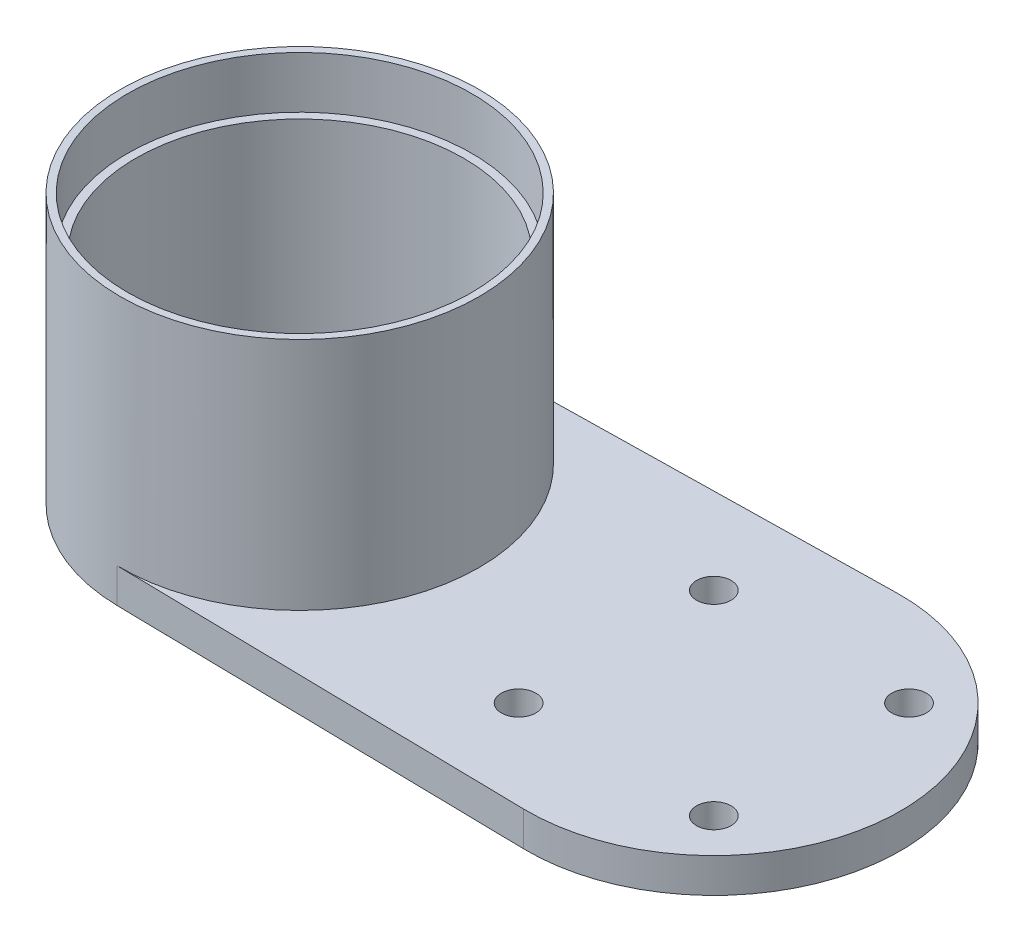
ISO-10303-21;
HEADER;
FILE_DESCRIPTION(('STEP AP214'),'2;1');
FILE_NAME('part.step','',(''),(''),'','','');
FILE_SCHEMA(('AUTOMOTIVE_DESIGN { 1 0 10303 214 1 1 1 1 }'));
ENDSEC;
DATA;
#1=APPLICATION_CONTEXT('core data for automotive mechanical design processes');
#2=APPLICATION_PROTOCOL_DEFINITION('international standard','automotive_design',2000,#1);
#3=PRODUCT_CONTEXT('',#1,'mechanical');
#4=PRODUCT('Part','Part','',(#3));
#5=PRODUCT_RELATED_PRODUCT_CATEGORY('part','',(#4));
#6=PRODUCT_DEFINITION_FORMATION('','',#4);
#7=PRODUCT_DEFINITION_CONTEXT('part definition',#1,'design');
#8=PRODUCT_DEFINITION('design','',#6,#7);
#9=PRODUCT_DEFINITION_SHAPE('','',#8);
#10=(LENGTH_UNIT() NAMED_UNIT(*) SI_UNIT(.MILLI.,.METRE.));
#11=(NAMED_UNIT(*) PLANE_ANGLE_UNIT() SI_UNIT($,.RADIAN.));
#12=(NAMED_UNIT(*) SI_UNIT($,.STERADIAN.) SOLID_ANGLE_UNIT());
#13=UNCERTAINTY_MEASURE_WITH_UNIT(LENGTH_MEASURE(1.E-05),#10,'distance_accuracy_value','');
#14=(GEOMETRIC_REPRESENTATION_CONTEXT(3) GLOBAL_UNCERTAINTY_ASSIGNED_CONTEXT((#13)) GLOBAL_UNIT_ASSIGNED_CONTEXT((#10,
#11,#12)) REPRESENTATION_CONTEXT('',''));
#15=CARTESIAN_POINT('',(0.,0.,0.));
#16=DIRECTION('',(0.,0.,1.));
#17=DIRECTION('',(1.,0.,0.));
#18=AXIS2_PLACEMENT_3D('',#15,#16,#17);
#19=CARTESIAN_POINT('',(0.,7.5,0.));
#20=DIRECTION('',(0.,-1.,0.));
#21=DIRECTION('',(0.,0.,-1.));
#22=AXIS2_PLACEMENT_3D('',#19,#20,#21);
#23=CYLINDRICAL_SURFACE('',#22,26.);
#24=CARTESIAN_POINT('',(0.,7.5,0.));
#25=DIRECTION('',(0.,1.,0.));
#26=DIRECTION('',(0.,0.,1.));
#27=AXIS2_PLACEMENT_3D('',#24,#25,#26);
#28=CIRCLE('',#27,26.);
#29=CARTESIAN_POINT('',(0.,7.5,26.));
#30=VERTEX_POINT('',#29);
#31=EDGE_CURVE('E11',#30,#30,#28,.T.);
#32=ORIENTED_EDGE('',*,*,#31,.F.);
#33=EDGE_LOOP('',(#32));
#34=FACE_BOUND('',#33,.T.);
#35=DIRECTION('',(0.,-1.,0.));
#36=VECTOR('',#35,1.);
#37=CARTESIAN_POINT('',(-0.467999999999999,-26.5,25.9957876587727));
#38=LINE('',#37,#36);
#39=CARTESIAN_POINT('',(-0.467999999999999,-26.5,25.9957876587727));
#40=VERTEX_POINT('',#39);
#41=CARTESIAN_POINT('',(-0.467999999999999,-31.5,25.9957876587727));
#42=VERTEX_POINT('',#41);
#43=EDGE_CURVE('E125',#40,#42,#38,.T.);
#44=ORIENTED_EDGE('',*,*,#43,.F.);
#45=CARTESIAN_POINT('',(0.,-26.5,0.));
#46=DIRECTION('',(0.,1.,0.));
#47=DIRECTION('',(0.,0.,1.));
#48=AXIS2_PLACEMENT_3D('',#45,#46,#47);
#49=CIRCLE('',#48,26.);
#50=CARTESIAN_POINT('',(-0.467999999999999,-26.5,-25.9957876587727));
#51=VERTEX_POINT('',#50);
#52=EDGE_CURVE('E69',#40,#51,#49,.T.);
#53=ORIENTED_EDGE('',*,*,#52,.T.);
#54=DIRECTION('',(0.,-1.,0.));
#55=VECTOR('',#54,1.);
#56=CARTESIAN_POINT('',(-0.467999999999999,-26.5,-25.9957876587727));
#57=LINE('',#56,#55);
#58=CARTESIAN_POINT('',(-0.467999999999999,-31.5,-25.9957876587727));
#59=VERTEX_POINT('',#58);
#60=EDGE_CURVE('E93',#51,#59,#57,.T.);
#61=ORIENTED_EDGE('',*,*,#60,.T.);
#62=CARTESIAN_POINT('',(0.,-31.5,0.));
#63=DIRECTION('',(0.,-1.,0.));
#64=DIRECTION('',(0.,0.,-1.));
#65=AXIS2_PLACEMENT_3D('',#62,#63,#64);
#66=CIRCLE('',#65,26.);
#67=EDGE_CURVE('E148',#42,#59,#66,.T.);
#68=ORIENTED_EDGE('',*,*,#67,.F.);
#69=EDGE_LOOP('',(#44,#53,#61,#68));
#70=FACE_BOUND('',#69,.T.);
#71=ADVANCED_FACE('F45',(#34,#70),#23,.T.);
#72=CARTESIAN_POINT('',(0.,-31.5,0.));
#73=DIRECTION('',(0.,1.,0.));
#74=DIRECTION('',(0.,0.,1.));
#75=AXIS2_PLACEMENT_3D('',#72,#73,#74);
#76=CYLINDRICAL_SURFACE('',#75,23.75);
#77=CARTESIAN_POINT('',(0.,0.,0.));
#78=DIRECTION('',(0.,-1.,0.));
#79=DIRECTION('',(0.,0.,-1.));
#80=AXIS2_PLACEMENT_3D('',#77,#78,#79);
#81=CIRCLE('',#80,23.75);
#82=CARTESIAN_POINT('',(0.,0.,-23.75));
#83=VERTEX_POINT('',#82);
#84=EDGE_CURVE('E144',#83,#83,#81,.T.);
#85=ORIENTED_EDGE('',*,*,#84,.F.);
#86=EDGE_LOOP('',(#85));
#87=FACE_BOUND('',#86,.T.);
#88=CARTESIAN_POINT('',(0.,-30.5,0.));
#89=DIRECTION('',(0.,-1.,0.));
#90=DIRECTION('',(0.,0.,-1.));
#91=AXIS2_PLACEMENT_3D('',#88,#89,#90);
#92=CIRCLE('',#91,23.75);
#93=CARTESIAN_POINT('',(0.,-30.5,-23.75));
#94=VERTEX_POINT('',#93);
#95=EDGE_CURVE('E137',#94,#94,#92,.T.);
#96=ORIENTED_EDGE('',*,*,#95,.T.);
#97=EDGE_LOOP('',(#96));
#98=FACE_BOUND('',#97,.T.);
#99=ADVANCED_FACE('F172',(#87,#98),#76,.F.);
#100=CARTESIAN_POINT('',(0.,7.5,0.));
#101=DIRECTION('',(0.,1.,0.));
#102=DIRECTION('',(0.,0.,1.));
#103=AXIS2_PLACEMENT_3D('',#100,#101,#102);
#104=PLANE('',#103);
#105=ORIENTED_EDGE('',*,*,#31,.T.);
#106=EDGE_LOOP('',(#105));
#107=FACE_BOUND('',#106,.T.);
#108=CARTESIAN_POINT('',(0.,7.5,0.));
#109=DIRECTION('',(0.,1.,0.));
#110=DIRECTION('',(0.,0.,1.));
#111=AXIS2_PLACEMENT_3D('',#108,#109,#110);
#112=CIRCLE('',#111,24.95);
#113=CARTESIAN_POINT('',(0.,7.5,24.95));
#114=VERTEX_POINT('',#113);
#115=EDGE_CURVE('E53',#114,#114,#112,.T.);
#116=ORIENTED_EDGE('',*,*,#115,.F.);
#117=EDGE_LOOP('',(#116));
#118=FACE_BOUND('',#117,.T.);
#119=ADVANCED_FACE('F162',(#107,#118),#104,.T.);
#120=CARTESIAN_POINT('',(0.,7.5,0.));
#121=DIRECTION('',(0.,-1.,0.));
#122=DIRECTION('',(0.,0.,-1.));
#123=AXIS2_PLACEMENT_3D('',#120,#121,#122);
#124=CYLINDRICAL_SURFACE('',#123,24.95);
#125=ORIENTED_EDGE('',*,*,#115,.T.);
#126=EDGE_LOOP('',(#125));
#127=FACE_BOUND('',#126,.T.);
#128=CARTESIAN_POINT('',(0.,0.,0.));
#129=DIRECTION('',(0.,1.,0.));
#130=DIRECTION('',(0.,0.,1.));
#131=AXIS2_PLACEMENT_3D('',#128,#129,#130);
#132=CIRCLE('',#131,24.95);
#133=CARTESIAN_POINT('',(0.,0.,24.95));
#134=VERTEX_POINT('',#133);
#135=EDGE_CURVE('E151',#134,#134,#132,.T.);
#136=ORIENTED_EDGE('',*,*,#135,.F.);
#137=EDGE_LOOP('',(#136));
#138=FACE_BOUND('',#137,.T.);
#139=ADVANCED_FACE('F160',(#127,#138),#124,.F.);
#140=CARTESIAN_POINT('',(0.,0.,0.));
#141=DIRECTION('',(0.,-1.,0.));
#142=DIRECTION('',(0.,0.,-1.));
#143=AXIS2_PLACEMENT_3D('',#140,#141,#142);
#144=PLANE('',#143);
#145=ORIENTED_EDGE('',*,*,#84,.T.);
#146=EDGE_LOOP('',(#145));
#147=FACE_BOUND('',#146,.T.);
#148=ORIENTED_EDGE('',*,*,#135,.T.);
#149=EDGE_LOOP('',(#148));
#150=FACE_BOUND('',#149,.T.);
#151=ADVANCED_FACE('F158',(#147,#150),#144,.F.);
#152=CARTESIAN_POINT('',(0.,-31.5,0.));
#153=DIRECTION('',(0.,-1.,0.));
#154=DIRECTION('',(0.,0.,-1.));
#155=AXIS2_PLACEMENT_3D('',#152,#153,#154);
#156=PLANE('',#155);
#157=CARTESIAN_POINT('',(45.8578643762691,-31.5,14.1421356237302));
#158=DIRECTION('',(0.,-1.,0.));
#159=DIRECTION('',(0.,0.,-1.));
#160=AXIS2_PLACEMENT_3D('',#157,#158,#159);
#161=CIRCLE('',#160,2.5);
#162=CARTESIAN_POINT('',(45.8578643762691,-31.5,11.6421356237302));
#163=VERTEX_POINT('',#162);
#164=EDGE_CURVE('E213',#163,#163,#161,.T.);
#165=ORIENTED_EDGE('',*,*,#164,.F.);
#166=EDGE_LOOP('',(#165));
#167=FACE_BOUND('',#166,.T.);
#168=CARTESIAN_POINT('',(45.8578643762699,-31.5,-14.1421356237318));
#169=DIRECTION('',(0.,-1.,0.));
#170=DIRECTION('',(0.,0.,-1.));
#171=AXIS2_PLACEMENT_3D('',#168,#169,#170);
#172=CIRCLE('',#171,2.5);
#173=CARTESIAN_POINT('',(45.8578643762699,-31.5,-16.6421356237318));
#174=VERTEX_POINT('',#173);
#175=EDGE_CURVE('E217',#174,#174,#172,.T.);
#176=ORIENTED_EDGE('',*,*,#175,.F.);
#177=EDGE_LOOP('',(#176));
#178=FACE_BOUND('',#177,.T.);
#179=CARTESIAN_POINT('',(74.1421356237318,-31.5,-14.1421356237309));
#180=DIRECTION('',(0.,-1.,0.));
#181=DIRECTION('',(0.,0.,-1.));
#182=AXIS2_PLACEMENT_3D('',#179,#180,#181);
#183=CIRCLE('',#182,2.5);
#184=CARTESIAN_POINT('',(74.1421356237318,-31.5,-16.6421356237309));
#185=VERTEX_POINT('',#184);
#186=EDGE_CURVE('E221',#185,#185,#183,.T.);
#187=ORIENTED_EDGE('',*,*,#186,.F.);
#188=EDGE_LOOP('',(#187));
#189=FACE_BOUND('',#188,.T.);
#190=CARTESIAN_POINT('',(74.1421356237308,-31.5,14.1421356237311));
#191=DIRECTION('',(0.,-1.,0.));
#192=DIRECTION('',(0.,0.,-1.));
#193=AXIS2_PLACEMENT_3D('',#190,#191,#192);
#194=CIRCLE('',#193,2.49999999999999);
#195=CARTESIAN_POINT('',(74.1421356237308,-31.5,11.6421356237311));
#196=VERTEX_POINT('',#195);
#197=EDGE_CURVE('E225',#196,#196,#194,.T.);
#198=ORIENTED_EDGE('',*,*,#197,.F.);
#199=EDGE_LOOP('',(#198));
#200=FACE_BOUND('',#199,.T.);
#201=CARTESIAN_POINT('',(0.,-31.5,0.));
#202=DIRECTION('',(0.,-1.,0.));
#203=DIRECTION('',(0.,0.,-1.));
#204=AXIS2_PLACEMENT_3D('',#201,#202,#203);
#205=CIRCLE('',#204,3.);
#206=CARTESIAN_POINT('',(0.,-31.5,-3.));
#207=VERTEX_POINT('',#206);
#208=EDGE_CURVE('E128',#207,#207,#205,.T.);
#209=ORIENTED_EDGE('',*,*,#208,.F.);
#210=EDGE_LOOP('',(#209));
#211=FACE_BOUND('',#210,.T.);
#212=ORIENTED_EDGE('',*,*,#67,.T.);
#213=DIRECTION('',(0.999837986875874,0.,-0.018));
#214=VECTOR('',#213,1.);
#215=CARTESIAN_POINT('',(59.51256,-31.5,-27.0756126845987));
#216=LINE('',#215,#214);
#217=CARTESIAN_POINT('',(59.51256,-31.5,-27.0756126845987));
#218=VERTEX_POINT('',#217);
#219=EDGE_CURVE('E117',#59,#218,#216,.T.);
#220=ORIENTED_EDGE('',*,*,#219,.T.);
#221=CARTESIAN_POINT('',(60.,-31.5,0.));
#222=DIRECTION('',(0.,-1.,0.));
#223=DIRECTION('',(0.,0.,-1.));
#224=AXIS2_PLACEMENT_3D('',#221,#222,#223);
#225=CIRCLE('',#224,27.08);
#226=CARTESIAN_POINT('',(59.51256,-31.5,27.0756126845987));
#227=VERTEX_POINT('',#226);
#228=EDGE_CURVE('E99',#218,#227,#225,.T.);
#229=ORIENTED_EDGE('',*,*,#228,.T.);
#230=DIRECTION('',(-0.999837986875874,0.,-0.018));
#231=VECTOR('',#230,1.);
#232=CARTESIAN_POINT('',(-0.467999999999999,-31.5,25.9957876587727));
#233=LINE('',#232,#231);
#234=EDGE_CURVE('E60',#227,#42,#233,.T.);
#235=ORIENTED_EDGE('',*,*,#234,.T.);
#236=EDGE_LOOP('',(#212,#220,#229,#235));
#237=FACE_BOUND('',#236,.T.);
#238=ADVANCED_FACE('F169',(#167,#178,#189,#200,#211,#237),#156,.T.);
#239=CARTESIAN_POINT('',(0.,-30.5,0.));
#240=DIRECTION('',(0.,-1.,0.));
#241=DIRECTION('',(0.,0.,-1.));
#242=AXIS2_PLACEMENT_3D('',#239,#240,#241);
#243=PLANE('',#242);
#244=CARTESIAN_POINT('',(0.,-30.5,0.));
#245=DIRECTION('',(0.,-1.,0.));
#246=DIRECTION('',(0.,0.,-1.));
#247=AXIS2_PLACEMENT_3D('',#244,#245,#246);
#248=CIRCLE('',#247,3.);
#249=CARTESIAN_POINT('',(0.,-30.5,-3.));
#250=VERTEX_POINT('',#249);
#251=EDGE_CURVE('E133',#250,#250,#248,.T.);
#252=ORIENTED_EDGE('',*,*,#251,.T.);
#253=EDGE_LOOP('',(#252));
#254=FACE_BOUND('',#253,.T.);
#255=ORIENTED_EDGE('',*,*,#95,.F.);
#256=EDGE_LOOP('',(#255));
#257=FACE_BOUND('',#256,.T.);
#258=ADVANCED_FACE('F195',(#254,#257),#243,.F.);
#259=CARTESIAN_POINT('',(0.,-30.5,0.));
#260=DIRECTION('',(0.,-1.,0.));
#261=DIRECTION('',(0.,0.,-1.));
#262=AXIS2_PLACEMENT_3D('',#259,#260,#261);
#263=CYLINDRICAL_SURFACE('',#262,3.);
#264=ORIENTED_EDGE('',*,*,#251,.F.);
#265=EDGE_LOOP('',(#264));
#266=FACE_BOUND('',#265,.T.);
#267=ORIENTED_EDGE('',*,*,#208,.T.);
#268=EDGE_LOOP('',(#267));
#269=FACE_BOUND('',#268,.T.);
#270=ADVANCED_FACE('F188',(#266,#269),#263,.F.);
#271=CARTESIAN_POINT('',(-0.467999999999999,-26.5,25.9957876587727));
#272=DIRECTION('',(-0.018,0.,0.999837986875874));
#273=DIRECTION('',(0.999837986875874,0.,0.018));
#274=AXIS2_PLACEMENT_3D('',#271,#272,#273);
#275=PLANE('',#274);
#276=ORIENTED_EDGE('',*,*,#234,.F.);
#277=DIRECTION('',(0.,-1.,0.));
#278=VECTOR('',#277,1.);
#279=CARTESIAN_POINT('',(59.51256,-26.5,27.0756126845987));
#280=LINE('',#279,#278);
#281=CARTESIAN_POINT('',(59.51256,-26.5,27.0756126845987));
#282=VERTEX_POINT('',#281);
#283=EDGE_CURVE('E87',#282,#227,#280,.T.);
#284=ORIENTED_EDGE('',*,*,#283,.F.);
#285=DIRECTION('',(-0.999837986875874,0.,-0.018));
#286=VECTOR('',#285,1.);
#287=CARTESIAN_POINT('',(-0.467999999999999,-26.5,25.9957876587727));
#288=LINE('',#287,#286);
#289=EDGE_CURVE('E105',#282,#40,#288,.T.);
#290=ORIENTED_EDGE('',*,*,#289,.T.);
#291=ORIENTED_EDGE('',*,*,#43,.T.);
#292=EDGE_LOOP('',(#276,#284,#290,#291));
#293=FACE_BOUND('',#292,.T.);
#294=ADVANCED_FACE('F186',(#293),#275,.T.);
#295=CARTESIAN_POINT('',(60.,-26.5,0.));
#296=DIRECTION('',(0.,-1.,0.));
#297=DIRECTION('',(0.,0.,-1.));
#298=AXIS2_PLACEMENT_3D('',#295,#296,#297);
#299=CYLINDRICAL_SURFACE('',#298,27.08);
#300=ORIENTED_EDGE('',*,*,#228,.F.);
#301=DIRECTION('',(0.,-1.,0.));
#302=VECTOR('',#301,1.);
#303=CARTESIAN_POINT('',(59.51256,-26.5,-27.0756126845987));
#304=LINE('',#303,#302);
#305=CARTESIAN_POINT('',(59.51256,-26.5,-27.0756126845987));
#306=VERTEX_POINT('',#305);
#307=EDGE_CURVE('E95',#306,#218,#304,.T.);
#308=ORIENTED_EDGE('',*,*,#307,.F.);
#309=CARTESIAN_POINT('',(60.,-26.5,0.));
#310=DIRECTION('',(0.,-1.,0.));
#311=DIRECTION('',(0.,0.,-1.));
#312=AXIS2_PLACEMENT_3D('',#309,#310,#311);
#313=CIRCLE('',#312,27.08);
#314=EDGE_CURVE('E98',#306,#282,#313,.T.);
#315=ORIENTED_EDGE('',*,*,#314,.T.);
#316=ORIENTED_EDGE('',*,*,#283,.T.);
#317=EDGE_LOOP('',(#300,#308,#315,#316));
#318=FACE_BOUND('',#317,.T.);
#319=ADVANCED_FACE('F97',(#318),#299,.T.);
#320=CARTESIAN_POINT('',(59.51256,-26.5,-27.0756126845987));
#321=DIRECTION('',(-0.018,0.,-0.999837986875874));
#322=DIRECTION('',(-0.999837986875874,0.,0.018));
#323=AXIS2_PLACEMENT_3D('',#320,#321,#322);
#324=PLANE('',#323);
#325=ORIENTED_EDGE('',*,*,#219,.F.);
#326=ORIENTED_EDGE('',*,*,#60,.F.);
#327=DIRECTION('',(0.999837986875874,0.,-0.018));
#328=VECTOR('',#327,1.);
#329=CARTESIAN_POINT('',(59.51256,-26.5,-27.0756126845987));
#330=LINE('',#329,#328);
#331=EDGE_CURVE('E104',#51,#306,#330,.T.);
#332=ORIENTED_EDGE('',*,*,#331,.T.);
#333=ORIENTED_EDGE('',*,*,#307,.T.);
#334=EDGE_LOOP('',(#325,#326,#332,#333));
#335=FACE_BOUND('',#334,.T.);
#336=ADVANCED_FACE('F108',(#335),#324,.T.);
#337=CARTESIAN_POINT('',(0.,-26.5,0.));
#338=DIRECTION('',(0.,1.,0.));
#339=DIRECTION('',(0.,0.,1.));
#340=AXIS2_PLACEMENT_3D('',#337,#338,#339);
#341=PLANE('',#340);
#342=CARTESIAN_POINT('',(45.8578643762691,-26.5,14.1421356237302));
#343=DIRECTION('',(0.,-1.,0.));
#344=DIRECTION('',(0.,0.,-1.));
#345=AXIS2_PLACEMENT_3D('',#342,#343,#344);
#346=CIRCLE('',#345,2.5);
#347=CARTESIAN_POINT('',(45.8578643762691,-26.5,11.6421356237302));
#348=VERTEX_POINT('',#347);
#349=EDGE_CURVE('E237',#348,#348,#346,.T.);
#350=ORIENTED_EDGE('',*,*,#349,.T.);
#351=EDGE_LOOP('',(#350));
#352=FACE_BOUND('',#351,.T.);
#353=CARTESIAN_POINT('',(45.8578643762699,-26.5,-14.1421356237318));
#354=DIRECTION('',(0.,-1.,0.));
#355=DIRECTION('',(0.,0.,-1.));
#356=AXIS2_PLACEMENT_3D('',#353,#354,#355);
#357=CIRCLE('',#356,2.5);
#358=CARTESIAN_POINT('',(45.8578643762699,-26.5,-16.6421356237318));
#359=VERTEX_POINT('',#358);
#360=EDGE_CURVE('E243',#359,#359,#357,.T.);
#361=ORIENTED_EDGE('',*,*,#360,.T.);
#362=EDGE_LOOP('',(#361));
#363=FACE_BOUND('',#362,.T.);
#364=CARTESIAN_POINT('',(74.1421356237318,-26.5,-14.1421356237309));
#365=DIRECTION('',(0.,-1.,0.));
#366=DIRECTION('',(0.,0.,-1.));
#367=AXIS2_PLACEMENT_3D('',#364,#365,#366);
#368=CIRCLE('',#367,2.5);
#369=CARTESIAN_POINT('',(74.1421356237318,-26.5,-16.6421356237309));
#370=VERTEX_POINT('',#369);
#371=EDGE_CURVE('E234',#370,#370,#368,.T.);
#372=ORIENTED_EDGE('',*,*,#371,.T.);
#373=EDGE_LOOP('',(#372));
#374=FACE_BOUND('',#373,.T.);
#375=CARTESIAN_POINT('',(74.1421356237308,-26.5,14.1421356237311));
#376=DIRECTION('',(0.,-1.,0.));
#377=DIRECTION('',(0.,0.,-1.));
#378=AXIS2_PLACEMENT_3D('',#375,#376,#377);
#379=CIRCLE('',#378,2.49999999999999);
#380=CARTESIAN_POINT('',(74.1421356237308,-26.5,11.6421356237311));
#381=VERTEX_POINT('',#380);
#382=EDGE_CURVE('E120',#381,#381,#379,.T.);
#383=ORIENTED_EDGE('',*,*,#382,.T.);
#384=EDGE_LOOP('',(#383));
#385=FACE_BOUND('',#384,.T.);
#386=ORIENTED_EDGE('',*,*,#52,.F.);
#387=ORIENTED_EDGE('',*,*,#289,.F.);
#388=ORIENTED_EDGE('',*,*,#314,.F.);
#389=ORIENTED_EDGE('',*,*,#331,.F.);
#390=EDGE_LOOP('',(#386,#387,#388,#389));
#391=FACE_BOUND('',#390,.T.);
#392=ADVANCED_FACE('F103',(#352,#363,#374,#385,#391),#341,.T.);
#393=CARTESIAN_POINT('',(74.1421356237308,-26.5,14.1421356237311));
#394=DIRECTION('',(0.,-1.,0.));
#395=DIRECTION('',(0.,0.,-1.));
#396=AXIS2_PLACEMENT_3D('',#393,#394,#395);
#397=CYLINDRICAL_SURFACE('',#396,2.49999999999999);
#398=ORIENTED_EDGE('',*,*,#382,.F.);
#399=EDGE_LOOP('',(#398));
#400=FACE_BOUND('',#399,.T.);
#401=ORIENTED_EDGE('',*,*,#197,.T.);
#402=EDGE_LOOP('',(#401));
#403=FACE_BOUND('',#402,.T.);
#404=ADVANCED_FACE('F259',(#400,#403),#397,.F.);
#405=CARTESIAN_POINT('',(74.1421356237318,-26.5,-14.1421356237309));
#406=DIRECTION('',(0.,-1.,0.));
#407=DIRECTION('',(0.,0.,-1.));
#408=AXIS2_PLACEMENT_3D('',#405,#406,#407);
#409=CYLINDRICAL_SURFACE('',#408,2.5);
#410=ORIENTED_EDGE('',*,*,#371,.F.);
#411=EDGE_LOOP('',(#410));
#412=FACE_BOUND('',#411,.T.);
#413=ORIENTED_EDGE('',*,*,#186,.T.);
#414=EDGE_LOOP('',(#413));
#415=FACE_BOUND('',#414,.T.);
#416=ADVANCED_FACE('F255',(#412,#415),#409,.F.);
#417=CARTESIAN_POINT('',(45.8578643762699,-26.5,-14.1421356237318));
#418=DIRECTION('',(0.,-1.,0.));
#419=DIRECTION('',(0.,0.,-1.));
#420=AXIS2_PLACEMENT_3D('',#417,#418,#419);
#421=CYLINDRICAL_SURFACE('',#420,2.5);
#422=ORIENTED_EDGE('',*,*,#360,.F.);
#423=EDGE_LOOP('',(#422));
#424=FACE_BOUND('',#423,.T.);
#425=ORIENTED_EDGE('',*,*,#175,.T.);
#426=EDGE_LOOP('',(#425));
#427=FACE_BOUND('',#426,.T.);
#428=ADVANCED_FACE('F258',(#424,#427),#421,.F.);
#429=CARTESIAN_POINT('',(45.8578643762691,-26.5,14.1421356237302));
#430=DIRECTION('',(0.,-1.,0.));
#431=DIRECTION('',(0.,0.,-1.));
#432=AXIS2_PLACEMENT_3D('',#429,#430,#431);
#433=CYLINDRICAL_SURFACE('',#432,2.5);
#434=ORIENTED_EDGE('',*,*,#349,.F.);
#435=EDGE_LOOP('',(#434));
#436=FACE_BOUND('',#435,.T.);
#437=ORIENTED_EDGE('',*,*,#164,.T.);
#438=EDGE_LOOP('',(#437));
#439=FACE_BOUND('',#438,.T.);
#440=ADVANCED_FACE('F265',(#436,#439),#433,.F.);
#441=CLOSED_SHELL('',(#71,#99,#119,#139,#151,#238,#258,#270,#294,#319,#336,#392,#404,#416,#428,#440));
#442=MANIFOLD_SOLID_BREP('B2',#441);
#443=ADVANCED_BREP_SHAPE_REPRESENTATION('',(#18,#442),#14);
#444=SHAPE_DEFINITION_REPRESENTATION(#9,#443);
ENDSEC;
END-ISO-10303-21;
